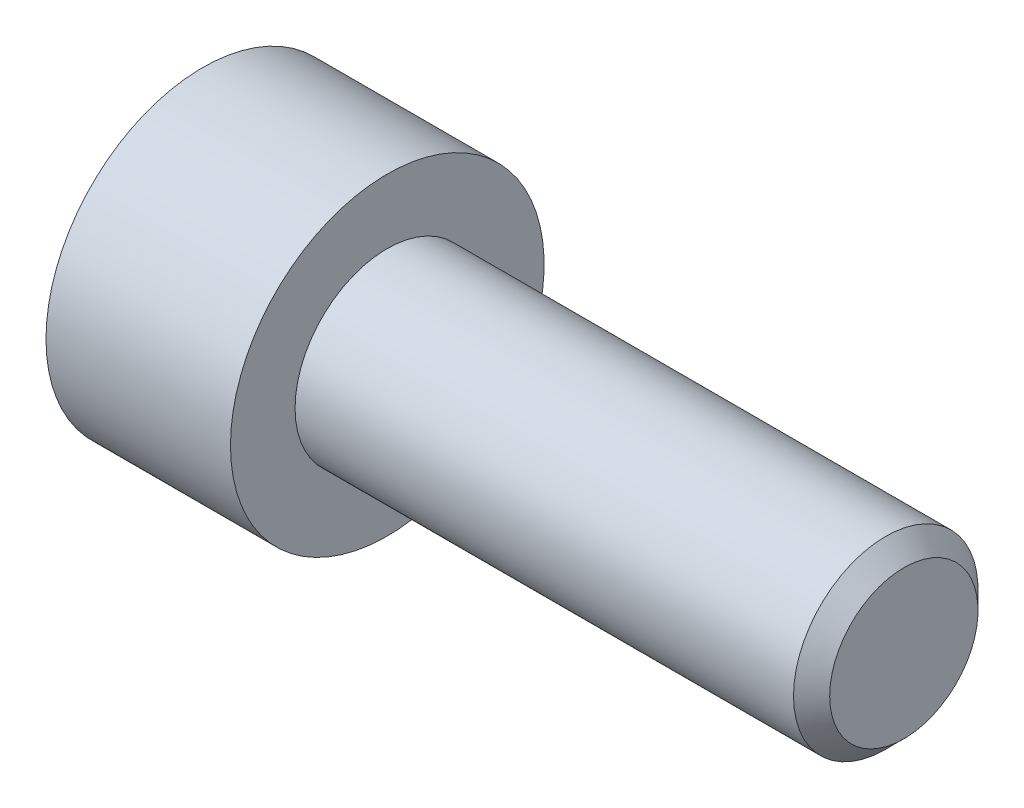
ISO-10303-21;
HEADER;
FILE_DESCRIPTION(('STEP AP214'),'2;1');
FILE_NAME('part.step','',(''),(''),'','','');
FILE_SCHEMA(('AUTOMOTIVE_DESIGN { 1 0 10303 214 1 1 1 1 }'));
ENDSEC;
DATA;
#1=APPLICATION_CONTEXT('core data for automotive mechanical design processes');
#2=APPLICATION_PROTOCOL_DEFINITION('international standard','automotive_design',2000,#1);
#3=PRODUCT_CONTEXT('',#1,'mechanical');
#4=PRODUCT('Part','Part','',(#3));
#5=PRODUCT_RELATED_PRODUCT_CATEGORY('part','',(#4));
#6=PRODUCT_DEFINITION_FORMATION('','',#4);
#7=PRODUCT_DEFINITION_CONTEXT('part definition',#1,'design');
#8=PRODUCT_DEFINITION('design','',#6,#7);
#9=PRODUCT_DEFINITION_SHAPE('','',#8);
#10=(LENGTH_UNIT() NAMED_UNIT(*) SI_UNIT(.MILLI.,.METRE.));
#11=(NAMED_UNIT(*) PLANE_ANGLE_UNIT() SI_UNIT($,.RADIAN.));
#12=(NAMED_UNIT(*) SI_UNIT($,.STERADIAN.) SOLID_ANGLE_UNIT());
#13=UNCERTAINTY_MEASURE_WITH_UNIT(LENGTH_MEASURE(1.E-05),#10,'distance_accuracy_value','');
#14=(GEOMETRIC_REPRESENTATION_CONTEXT(3) GLOBAL_UNCERTAINTY_ASSIGNED_CONTEXT((#13)) GLOBAL_UNIT_ASSIGNED_CONTEXT((#10,
#11,#12)) REPRESENTATION_CONTEXT('',''));
#15=CARTESIAN_POINT('',(0.,0.,0.));
#16=DIRECTION('',(0.,0.,1.));
#17=DIRECTION('',(1.,0.,0.));
#18=AXIS2_PLACEMENT_3D('',#15,#16,#17);
#19=CARTESIAN_POINT('',(-2.5,0.,0.));
#20=DIRECTION('',(1.,0.,0.));
#21=DIRECTION('',(0.,0.,-1.));
#22=AXIS2_PLACEMENT_3D('',#19,#20,#21);
#23=PLANE('',#22);
#24=DIRECTION('',(0.,-0.5,-0.866025403784438));
#25=VECTOR('',#24,1.);
#26=CARTESIAN_POINT('',(-2.5,-1.15470053837925,2.));
#27=LINE('',#26,#25);
#28=CARTESIAN_POINT('',(-2.5,-1.15470053837925,2.));
#29=VERTEX_POINT('',#28);
#30=CARTESIAN_POINT('',(-2.49999999999886,-1.73205080757302,1.00000000000238));
#31=VERTEX_POINT('',#30);
#32=EDGE_CURVE('E93',#29,#31,#27,.T.);
#33=ORIENTED_EDGE('',*,*,#32,.F.);
#34=DIRECTION('',(0.,1.,0.));
#35=VECTOR('',#34,1.);
#36=CARTESIAN_POINT('',(-2.5,0.,2.));
#37=LINE('',#36,#35);
#38=CARTESIAN_POINT('',(-2.49999999999886,0.,2.00000000000477));
#39=VERTEX_POINT('',#38);
#40=EDGE_CURVE('E89',#39,#29,#37,.F.);
#41=ORIENTED_EDGE('',*,*,#40,.F.);
#42=CARTESIAN_POINT('',(-2.49999999999773,0.,0.));
#43=DIRECTION('',(-1.,0.,0.));
#44=DIRECTION('',(0.,0.,1.));
#45=AXIS2_PLACEMENT_3D('',#42,#43,#44);
#46=CIRCLE('',#45,2.00000000000955);
#47=EDGE_CURVE('E20',#39,#31,#46,.F.);
#48=ORIENTED_EDGE('',*,*,#47,.T.);
#49=EDGE_LOOP('',(#33,#41,#48));
#50=FACE_BOUND('',#49,.T.);
#51=ADVANCED_FACE('F17',(#50),#23,.F.);
#52=CARTESIAN_POINT('',(-2.5,0.,0.));
#53=DIRECTION('',(1.,0.,0.));
#54=DIRECTION('',(0.,0.,-1.));
#55=AXIS2_PLACEMENT_3D('',#52,#53,#54);
#56=PLANE('',#55);
#57=DIRECTION('',(0.,0.500000000000001,-0.866025403784438));
#58=VECTOR('',#57,1.);
#59=CARTESIAN_POINT('',(-2.5,-2.3094010767585,0.));
#60=LINE('',#59,#58);
#61=CARTESIAN_POINT('',(-2.5,-2.3094010767585,0.));
#62=VERTEX_POINT('',#61);
#63=CARTESIAN_POINT('',(-2.49999999999886,-1.73205080757302,-1.00000000000237));
#64=VERTEX_POINT('',#63);
#65=EDGE_CURVE('E150',#62,#64,#60,.T.);
#66=ORIENTED_EDGE('',*,*,#65,.F.);
#67=DIRECTION('',(0.,-0.499999999999999,-0.866025403784439));
#68=VECTOR('',#67,1.);
#69=CARTESIAN_POINT('',(-2.5,-1.73205080756888,0.999999999999993));
#70=LINE('',#69,#68);
#71=EDGE_CURVE('E154',#31,#62,#70,.T.);
#72=ORIENTED_EDGE('',*,*,#71,.F.);
#73=CARTESIAN_POINT('',(-2.49999999999773,0.,0.));
#74=DIRECTION('',(-1.,0.,0.));
#75=DIRECTION('',(0.,0.,1.));
#76=AXIS2_PLACEMENT_3D('',#73,#74,#75);
#77=CIRCLE('',#76,2.00000000000955);
#78=EDGE_CURVE('E108',#31,#64,#77,.F.);
#79=ORIENTED_EDGE('',*,*,#78,.T.);
#80=EDGE_LOOP('',(#66,#72,#79));
#81=FACE_BOUND('',#80,.T.);
#82=ADVANCED_FACE('F210',(#81),#56,.F.);
#83=CARTESIAN_POINT('',(-2.5,0.,0.));
#84=DIRECTION('',(1.,0.,0.));
#85=DIRECTION('',(0.,0.,-1.));
#86=AXIS2_PLACEMENT_3D('',#83,#84,#85);
#87=PLANE('',#86);
#88=DIRECTION('',(0.,1.,0.));
#89=VECTOR('',#88,1.);
#90=CARTESIAN_POINT('',(-2.5,0.,-2.));
#91=LINE('',#90,#89);
#92=CARTESIAN_POINT('',(-2.5,-1.15470053837925,-2.));
#93=VERTEX_POINT('',#92);
#94=CARTESIAN_POINT('',(-2.49999999999886,0.,-2.00000000000477));
#95=VERTEX_POINT('',#94);
#96=EDGE_CURVE('E142',#93,#95,#91,.T.);
#97=ORIENTED_EDGE('',*,*,#96,.F.);
#98=DIRECTION('',(0.,0.499999999999997,-0.86602540378444));
#99=VECTOR('',#98,1.);
#100=CARTESIAN_POINT('',(-2.5,-1.73205080756888,-0.999999999999985));
#101=LINE('',#100,#99);
#102=EDGE_CURVE('E146',#64,#93,#101,.T.);
#103=ORIENTED_EDGE('',*,*,#102,.F.);
#104=CARTESIAN_POINT('',(-2.49999999999773,0.,0.));
#105=DIRECTION('',(-1.,0.,0.));
#106=DIRECTION('',(0.,0.,1.));
#107=AXIS2_PLACEMENT_3D('',#104,#105,#106);
#108=CIRCLE('',#107,2.00000000000955);
#109=EDGE_CURVE('E205',#64,#95,#108,.F.);
#110=ORIENTED_EDGE('',*,*,#109,.T.);
#111=EDGE_LOOP('',(#97,#103,#110));
#112=FACE_BOUND('',#111,.T.);
#113=ADVANCED_FACE('F213',(#112),#87,.F.);
#114=CARTESIAN_POINT('',(-2.5,0.,0.));
#115=DIRECTION('',(1.,0.,0.));
#116=DIRECTION('',(0.,0.,-1.));
#117=AXIS2_PLACEMENT_3D('',#114,#115,#116);
#118=PLANE('',#117);
#119=DIRECTION('',(0.,0.5,0.866025403784439));
#120=VECTOR('',#119,1.);
#121=CARTESIAN_POINT('',(-2.5,1.15470053837925,-2.));
#122=LINE('',#121,#120);
#123=CARTESIAN_POINT('',(-2.5,1.15470053837925,-2.));
#124=VERTEX_POINT('',#123);
#125=CARTESIAN_POINT('',(-2.49999999999886,1.73205080757301,-1.0000000000024));
#126=VERTEX_POINT('',#125);
#127=EDGE_CURVE('E134',#124,#126,#122,.T.);
#128=ORIENTED_EDGE('',*,*,#127,.F.);
#129=DIRECTION('',(0.,1.,0.));
#130=VECTOR('',#129,1.);
#131=CARTESIAN_POINT('',(-2.5,0.,-2.));
#132=LINE('',#131,#130);
#133=EDGE_CURVE('E138',#95,#124,#132,.T.);
#134=ORIENTED_EDGE('',*,*,#133,.F.);
#135=CARTESIAN_POINT('',(-2.49999999999773,0.,0.));
#136=DIRECTION('',(-1.,0.,0.));
#137=DIRECTION('',(0.,0.,1.));
#138=AXIS2_PLACEMENT_3D('',#135,#136,#137);
#139=CIRCLE('',#138,2.00000000000955);
#140=EDGE_CURVE('E202',#95,#126,#139,.F.);
#141=ORIENTED_EDGE('',*,*,#140,.T.);
#142=EDGE_LOOP('',(#128,#134,#141));
#143=FACE_BOUND('',#142,.T.);
#144=ADVANCED_FACE('F220',(#143),#118,.F.);
#145=CARTESIAN_POINT('',(-2.5,0.,0.));
#146=DIRECTION('',(1.,0.,0.));
#147=DIRECTION('',(0.,0.,-1.));
#148=AXIS2_PLACEMENT_3D('',#145,#146,#147);
#149=PLANE('',#148);
#150=CARTESIAN_POINT('',(-2.49999999999773,0.,0.));
#151=DIRECTION('',(-1.,0.,0.));
#152=DIRECTION('',(0.,0.,1.));
#153=AXIS2_PLACEMENT_3D('',#150,#151,#152);
#154=CIRCLE('',#153,2.00000000000955);
#155=CARTESIAN_POINT('',(-2.49999999999886,1.73205080757302,1.00000000000237));
#156=VERTEX_POINT('',#155);
#157=EDGE_CURVE('E116',#126,#156,#154,.F.);
#158=ORIENTED_EDGE('',*,*,#157,.T.);
#159=DIRECTION('',(0.,-0.500000000000002,0.866025403784438));
#160=VECTOR('',#159,1.);
#161=CARTESIAN_POINT('',(-2.5,2.3094010767585,0.));
#162=LINE('',#161,#160);
#163=CARTESIAN_POINT('',(-2.5,2.3094010767585,0.));
#164=VERTEX_POINT('',#163);
#165=EDGE_CURVE('E130',#164,#156,#162,.T.);
#166=ORIENTED_EDGE('',*,*,#165,.F.);
#167=DIRECTION('',(0.,0.499999999999999,0.866025403784439));
#168=VECTOR('',#167,1.);
#169=CARTESIAN_POINT('',(-2.5,1.73205080756887,-1.00000000000001));
#170=LINE('',#169,#168);
#171=EDGE_CURVE('E109',#126,#164,#170,.T.);
#172=ORIENTED_EDGE('',*,*,#171,.F.);
#173=EDGE_LOOP('',(#158,#166,#172));
#174=FACE_BOUND('',#173,.T.);
#175=ADVANCED_FACE('F223',(#174),#149,.F.);
#176=CARTESIAN_POINT('',(-2.49999999999773,0.,0.));
#177=DIRECTION('',(-1.,0.,0.));
#178=DIRECTION('',(0.,0.,1.));
#179=AXIS2_PLACEMENT_3D('',#176,#177,#178);
#180=CONICAL_SURFACE('',#179,2.00000000000955,1.30899693893931);
#181=CARTESIAN_POINT('',(-1.96410161524341,0.,4.54747350886464E-10));
#182=VERTEX_POINT('',#181);
#183=VERTEX_LOOP('',#182);
#184=FACE_BOUND('',#183,.T.);
#185=ORIENTED_EDGE('',*,*,#47,.F.);
#186=CARTESIAN_POINT('',(-2.49999999999773,0.,0.));
#187=DIRECTION('',(-1.,0.,0.));
#188=DIRECTION('',(0.,0.,1.));
#189=AXIS2_PLACEMENT_3D('',#186,#187,#188);
#190=CIRCLE('',#189,2.00000000000955);
#191=EDGE_CURVE('E104',#39,#156,#190,.T.);
#192=ORIENTED_EDGE('',*,*,#191,.T.);
#193=ORIENTED_EDGE('',*,*,#157,.F.);
#194=ORIENTED_EDGE('',*,*,#140,.F.);
#195=ORIENTED_EDGE('',*,*,#109,.F.);
#196=ORIENTED_EDGE('',*,*,#78,.F.);
#197=EDGE_LOOP('',(#185,#192,#193,#194,#195,#196));
#198=FACE_BOUND('',#197,.T.);
#199=ADVANCED_FACE('F102',(#184,#198),#180,.F.);
#200=CARTESIAN_POINT('',(-2.5,0.,0.));
#201=DIRECTION('',(1.,0.,0.));
#202=DIRECTION('',(0.,0.,-1.));
#203=AXIS2_PLACEMENT_3D('',#200,#201,#202);
#204=PLANE('',#203);
#205=DIRECTION('',(0.,1.,0.));
#206=VECTOR('',#205,1.);
#207=CARTESIAN_POINT('',(-2.5,1.15470053837925,2.));
#208=LINE('',#207,#206);
#209=CARTESIAN_POINT('',(-2.5,1.15470053837925,2.));
#210=VERTEX_POINT('',#209);
#211=EDGE_CURVE('E112',#210,#39,#208,.F.);
#212=ORIENTED_EDGE('',*,*,#211,.F.);
#213=DIRECTION('',(0.,0.5,-0.866025403784439));
#214=VECTOR('',#213,1.);
#215=CARTESIAN_POINT('',(-2.5,2.3094010767585,0.));
#216=LINE('',#215,#214);
#217=EDGE_CURVE('E115',#156,#210,#216,.F.);
#218=ORIENTED_EDGE('',*,*,#217,.F.);
#219=ORIENTED_EDGE('',*,*,#191,.F.);
#220=EDGE_LOOP('',(#212,#218,#219));
#221=FACE_BOUND('',#220,.T.);
#222=ADVANCED_FACE('F111',(#221),#204,.F.);
#223=CARTESIAN_POINT('',(-2.5,1.15470053837925,2.));
#224=DIRECTION('',(0.,0.,-1.));
#225=DIRECTION('',(-1.,0.,0.));
#226=AXIS2_PLACEMENT_3D('',#223,#224,#225);
#227=PLANE('',#226);
#228=ORIENTED_EDGE('',*,*,#40,.T.);
#229=DIRECTION('',(1.,0.,0.));
#230=VECTOR('',#229,1.);
#231=CARTESIAN_POINT('',(-2.5,-1.15470053837925,2.));
#232=LINE('',#231,#230);
#233=CARTESIAN_POINT('',(-5.,-1.15470053837925,2.));
#234=VERTEX_POINT('',#233);
#235=EDGE_CURVE('E177',#234,#29,#232,.T.);
#236=ORIENTED_EDGE('',*,*,#235,.F.);
#237=DIRECTION('',(0.,1.,0.));
#238=VECTOR('',#237,1.);
#239=CARTESIAN_POINT('',(-5.,0.,2.));
#240=LINE('',#239,#238);
#241=CARTESIAN_POINT('',(-5.,1.15470053837925,2.));
#242=VERTEX_POINT('',#241);
#243=EDGE_CURVE('E182',#234,#242,#240,.T.);
#244=ORIENTED_EDGE('',*,*,#243,.T.);
#245=DIRECTION('',(1.,0.,0.));
#246=VECTOR('',#245,1.);
#247=CARTESIAN_POINT('',(-2.5,1.15470053837925,2.));
#248=LINE('',#247,#246);
#249=EDGE_CURVE('E120',#210,#242,#248,.F.);
#250=ORIENTED_EDGE('',*,*,#249,.F.);
#251=ORIENTED_EDGE('',*,*,#211,.T.);
#252=EDGE_LOOP('',(#228,#236,#244,#250,#251));
#253=FACE_BOUND('',#252,.T.);
#254=ADVANCED_FACE('F118',(#253),#227,.T.);
#255=CARTESIAN_POINT('',(-2.5,2.3094010767585,0.));
#256=DIRECTION('',(0.,-0.866025403784439,-0.5));
#257=DIRECTION('',(0.,0.5,-0.866025403784439));
#258=AXIS2_PLACEMENT_3D('',#255,#256,#257);
#259=PLANE('',#258);
#260=ORIENTED_EDGE('',*,*,#217,.T.);
#261=ORIENTED_EDGE('',*,*,#249,.T.);
#262=DIRECTION('',(0.,0.499999999999999,-0.866025403784439));
#263=VECTOR('',#262,1.);
#264=CARTESIAN_POINT('',(-5.,1.15470053837925,2.));
#265=LINE('',#264,#263);
#266=CARTESIAN_POINT('',(-5.,2.3094010767585,0.));
#267=VERTEX_POINT('',#266);
#268=EDGE_CURVE('E232',#242,#267,#265,.T.);
#269=ORIENTED_EDGE('',*,*,#268,.T.);
#270=DIRECTION('',(1.,0.,0.));
#271=VECTOR('',#270,1.);
#272=CARTESIAN_POINT('',(-2.5,2.3094010767585,0.));
#273=LINE('',#272,#271);
#274=EDGE_CURVE('E165',#164,#267,#273,.F.);
#275=ORIENTED_EDGE('',*,*,#274,.F.);
#276=ORIENTED_EDGE('',*,*,#165,.T.);
#277=EDGE_LOOP('',(#260,#261,#269,#275,#276));
#278=FACE_BOUND('',#277,.T.);
#279=ADVANCED_FACE('F230',(#278),#259,.T.);
#280=CARTESIAN_POINT('',(-2.5,1.15470053837925,-2.));
#281=DIRECTION('',(0.,-0.866025403784439,0.5));
#282=DIRECTION('',(0.,-0.5,-0.866025403784439));
#283=AXIS2_PLACEMENT_3D('',#280,#281,#282);
#284=PLANE('',#283);
#285=ORIENTED_EDGE('',*,*,#171,.T.);
#286=ORIENTED_EDGE('',*,*,#274,.T.);
#287=DIRECTION('',(0.,-0.5,-0.866025403784439));
#288=VECTOR('',#287,1.);
#289=CARTESIAN_POINT('',(-5.,2.3094010767585,0.));
#290=LINE('',#289,#288);
#291=CARTESIAN_POINT('',(-5.,1.15470053837925,-2.));
#292=VERTEX_POINT('',#291);
#293=EDGE_CURVE('E235',#267,#292,#290,.T.);
#294=ORIENTED_EDGE('',*,*,#293,.T.);
#295=DIRECTION('',(1.,0.,0.));
#296=VECTOR('',#295,1.);
#297=CARTESIAN_POINT('',(-2.5,1.15470053837925,-2.));
#298=LINE('',#297,#296);
#299=EDGE_CURVE('E168',#124,#292,#298,.F.);
#300=ORIENTED_EDGE('',*,*,#299,.F.);
#301=ORIENTED_EDGE('',*,*,#127,.T.);
#302=EDGE_LOOP('',(#285,#286,#294,#300,#301));
#303=FACE_BOUND('',#302,.T.);
#304=ADVANCED_FACE('F226',(#303),#284,.T.);
#305=CARTESIAN_POINT('',(-2.5,-1.15470053837925,-2.));
#306=DIRECTION('',(0.,0.,1.));
#307=DIRECTION('',(1.,0.,0.));
#308=AXIS2_PLACEMENT_3D('',#305,#306,#307);
#309=PLANE('',#308);
#310=ORIENTED_EDGE('',*,*,#133,.T.);
#311=ORIENTED_EDGE('',*,*,#299,.T.);
#312=DIRECTION('',(0.,1.,0.));
#313=VECTOR('',#312,1.);
#314=CARTESIAN_POINT('',(-5.,0.,-2.));
#315=LINE('',#314,#313);
#316=CARTESIAN_POINT('',(-5.,-1.15470053837925,-2.));
#317=VERTEX_POINT('',#316);
#318=EDGE_CURVE('E237',#292,#317,#315,.F.);
#319=ORIENTED_EDGE('',*,*,#318,.T.);
#320=DIRECTION('',(1.,0.,0.));
#321=VECTOR('',#320,1.);
#322=CARTESIAN_POINT('',(-2.5,-1.15470053837925,-2.));
#323=LINE('',#322,#321);
#324=EDGE_CURVE('E173',#93,#317,#323,.F.);
#325=ORIENTED_EDGE('',*,*,#324,.F.);
#326=ORIENTED_EDGE('',*,*,#96,.T.);
#327=EDGE_LOOP('',(#310,#311,#319,#325,#326));
#328=FACE_BOUND('',#327,.T.);
#329=ADVANCED_FACE('F336',(#328),#309,.T.);
#330=CARTESIAN_POINT('',(-2.5,-2.3094010767585,0.));
#331=DIRECTION('',(0.,0.866025403784439,0.5));
#332=DIRECTION('',(0.,-0.5,0.866025403784439));
#333=AXIS2_PLACEMENT_3D('',#330,#331,#332);
#334=PLANE('',#333);
#335=ORIENTED_EDGE('',*,*,#102,.T.);
#336=ORIENTED_EDGE('',*,*,#324,.T.);
#337=DIRECTION('',(0.,-0.499999999999999,0.866025403784439));
#338=VECTOR('',#337,1.);
#339=CARTESIAN_POINT('',(-5.,-1.15470053837925,-2.));
#340=LINE('',#339,#338);
#341=CARTESIAN_POINT('',(-5.,-2.3094010767585,0.));
#342=VERTEX_POINT('',#341);
#343=EDGE_CURVE('E35',#317,#342,#340,.T.);
#344=ORIENTED_EDGE('',*,*,#343,.T.);
#345=DIRECTION('',(1.,0.,0.));
#346=VECTOR('',#345,1.);
#347=CARTESIAN_POINT('',(-2.5,-2.3094010767585,0.));
#348=LINE('',#347,#346);
#349=EDGE_CURVE('E180',#62,#342,#348,.F.);
#350=ORIENTED_EDGE('',*,*,#349,.F.);
#351=ORIENTED_EDGE('',*,*,#65,.T.);
#352=EDGE_LOOP('',(#335,#336,#344,#350,#351));
#353=FACE_BOUND('',#352,.T.);
#354=ADVANCED_FACE('F327',(#353),#334,.T.);
#355=CARTESIAN_POINT('',(-2.5,-1.15470053837925,2.));
#356=DIRECTION('',(0.,0.866025403784439,-0.5));
#357=DIRECTION('',(0.,0.5,0.866025403784439));
#358=AXIS2_PLACEMENT_3D('',#355,#356,#357);
#359=PLANE('',#358);
#360=ORIENTED_EDGE('',*,*,#71,.T.);
#361=ORIENTED_EDGE('',*,*,#349,.T.);
#362=DIRECTION('',(0.,0.5,0.866025403784439));
#363=VECTOR('',#362,1.);
#364=CARTESIAN_POINT('',(-5.,-2.3094010767585,0.));
#365=LINE('',#364,#363);
#366=EDGE_CURVE('E198',#342,#234,#365,.T.);
#367=ORIENTED_EDGE('',*,*,#366,.T.);
#368=ORIENTED_EDGE('',*,*,#235,.T.);
#369=ORIENTED_EDGE('',*,*,#32,.T.);
#370=EDGE_LOOP('',(#360,#361,#367,#368,#369));
#371=FACE_BOUND('',#370,.T.);
#372=ADVANCED_FACE('F248',(#371),#359,.T.);
#373=CARTESIAN_POINT('',(-5.,0.,0.));
#374=DIRECTION('',(1.,0.,0.));
#375=DIRECTION('',(0.,0.,-1.));
#376=AXIS2_PLACEMENT_3D('',#373,#374,#375);
#377=PLANE('',#376);
#378=ORIENTED_EDGE('',*,*,#343,.F.);
#379=ORIENTED_EDGE('',*,*,#318,.F.);
#380=ORIENTED_EDGE('',*,*,#293,.F.);
#381=ORIENTED_EDGE('',*,*,#268,.F.);
#382=ORIENTED_EDGE('',*,*,#243,.F.);
#383=ORIENTED_EDGE('',*,*,#366,.F.);
#384=EDGE_LOOP('',(#378,#379,#380,#381,#382,#383));
#385=FACE_BOUND('',#384,.T.);
#386=CARTESIAN_POINT('',(-5.,0.,0.));
#387=DIRECTION('',(-1.,0.,0.));
#388=DIRECTION('',(0.,0.,1.));
#389=AXIS2_PLACEMENT_3D('',#386,#387,#388);
#390=CIRCLE('',#389,4.25);
#391=CARTESIAN_POINT('',(-5.,0.,4.25));
#392=VERTEX_POINT('',#391);
#393=EDGE_CURVE('E196',#392,#392,#390,.F.);
#394=ORIENTED_EDGE('',*,*,#393,.F.);
#395=EDGE_LOOP('',(#394));
#396=FACE_BOUND('',#395,.T.);
#397=ADVANCED_FACE('F249',(#385,#396),#377,.F.);
#398=CARTESIAN_POINT('',(14.,0.,0.));
#399=DIRECTION('',(-1.,0.,0.));
#400=DIRECTION('',(0.,0.,1.));
#401=AXIS2_PLACEMENT_3D('',#398,#399,#400);
#402=CYLINDRICAL_SURFACE('',#401,4.25);
#403=ORIENTED_EDGE('',*,*,#393,.T.);
#404=EDGE_LOOP('',(#403));
#405=FACE_BOUND('',#404,.T.);
#406=CARTESIAN_POINT('',(0.,0.,0.));
#407=DIRECTION('',(-1.,0.,0.));
#408=DIRECTION('',(0.,0.,1.));
#409=AXIS2_PLACEMENT_3D('',#406,#407,#408);
#410=CIRCLE('',#409,4.25);
#411=CARTESIAN_POINT('',(0.,0.,4.25));
#412=VERTEX_POINT('',#411);
#413=EDGE_CURVE('E193',#412,#412,#410,.T.);
#414=ORIENTED_EDGE('',*,*,#413,.T.);
#415=EDGE_LOOP('',(#414));
#416=FACE_BOUND('',#415,.T.);
#417=ADVANCED_FACE('F253',(#405,#416),#402,.T.);
#418=CARTESIAN_POINT('',(14.,2.0095,0.));
#419=DIRECTION('',(-1.,0.,0.));
#420=DIRECTION('',(0.,0.,1.));
#421=AXIS2_PLACEMENT_3D('',#418,#419,#420);
#422=PLANE('',#421);
#423=CARTESIAN_POINT('',(14.00000000001,0.,0.));
#424=DIRECTION('',(-1.,0.,0.));
#425=DIRECTION('',(0.,0.,1.));
#426=AXIS2_PLACEMENT_3D('',#423,#424,#425);
#427=CIRCLE('',#426,2.00950000004241);
#428=CARTESIAN_POINT('',(14.00000000001,0.,2.00950000004241));
#429=VERTEX_POINT('',#428);
#430=EDGE_CURVE('E190',#429,#429,#427,.T.);
#431=ORIENTED_EDGE('',*,*,#430,.F.);
#432=EDGE_LOOP('',(#431));
#433=FACE_BOUND('',#432,.T.);
#434=ADVANCED_FACE('F259',(#433),#422,.F.);
#435=CARTESIAN_POINT('',(0.,4.25,0.));
#436=DIRECTION('',(-1.,0.,0.));
#437=DIRECTION('',(0.,0.,1.));
#438=AXIS2_PLACEMENT_3D('',#435,#436,#437);
#439=PLANE('',#438);
#440=CARTESIAN_POINT('',(0.,0.,0.));
#441=DIRECTION('',(-1.,0.,0.));
#442=DIRECTION('',(0.,0.,1.));
#443=AXIS2_PLACEMENT_3D('',#440,#441,#442);
#444=CIRCLE('',#443,2.5);
#445=CARTESIAN_POINT('',(0.,0.,2.5));
#446=VERTEX_POINT('',#445);
#447=EDGE_CURVE('E26',#446,#446,#444,.F.);
#448=ORIENTED_EDGE('',*,*,#447,.F.);
#449=EDGE_LOOP('',(#448));
#450=FACE_BOUND('',#449,.T.);
#451=ORIENTED_EDGE('',*,*,#413,.F.);
#452=EDGE_LOOP('',(#451));
#453=FACE_BOUND('',#452,.T.);
#454=ADVANCED_FACE('F263',(#450,#453),#439,.F.);
#455=CARTESIAN_POINT('',(13.5094999999978,0.,0.));
#456=DIRECTION('',(-1.,0.,0.));
#457=DIRECTION('',(0.,0.,1.));
#458=AXIS2_PLACEMENT_3D('',#455,#456,#457);
#459=CONICAL_SURFACE('',#458,2.50000000005457,0.785398163397448);
#460=ORIENTED_EDGE('',*,*,#430,.T.);
#461=EDGE_LOOP('',(#460));
#462=FACE_BOUND('',#461,.T.);
#463=CARTESIAN_POINT('',(13.5095,0.,0.));
#464=DIRECTION('',(-1.,0.,0.));
#465=DIRECTION('',(0.,0.,1.));
#466=AXIS2_PLACEMENT_3D('',#463,#464,#465);
#467=CIRCLE('',#466,2.5);
#468=CARTESIAN_POINT('',(13.5095,0.,2.5));
#469=VERTEX_POINT('',#468);
#470=EDGE_CURVE('E11',#469,#469,#467,.T.);
#471=ORIENTED_EDGE('',*,*,#470,.F.);
#472=EDGE_LOOP('',(#471));
#473=FACE_BOUND('',#472,.T.);
#474=ADVANCED_FACE('F265',(#462,#473),#459,.T.);
#475=CARTESIAN_POINT('',(14.,0.,0.));
#476=DIRECTION('',(-1.,0.,0.));
#477=DIRECTION('',(0.,0.,1.));
#478=AXIS2_PLACEMENT_3D('',#475,#476,#477);
#479=CYLINDRICAL_SURFACE('',#478,2.5);
#480=ORIENTED_EDGE('',*,*,#470,.T.);
#481=EDGE_LOOP('',(#480));
#482=FACE_BOUND('',#481,.T.);
#483=ORIENTED_EDGE('',*,*,#447,.T.);
#484=EDGE_LOOP('',(#483));
#485=FACE_BOUND('',#484,.T.);
#486=ADVANCED_FACE('F273',(#482,#485),#479,.T.);
#487=CLOSED_SHELL('',(#51,#82,#113,#144,#175,#199,#222,#254,#279,#304,#329,#354,#372,#397,#417,
#434,#454,#474,#486));
#488=MANIFOLD_SOLID_BREP('B1',#487);
#489=ADVANCED_BREP_SHAPE_REPRESENTATION('',(#18,#488),#14);
#490=SHAPE_DEFINITION_REPRESENTATION(#9,#489);
ENDSEC;
END-ISO-10303-21;
